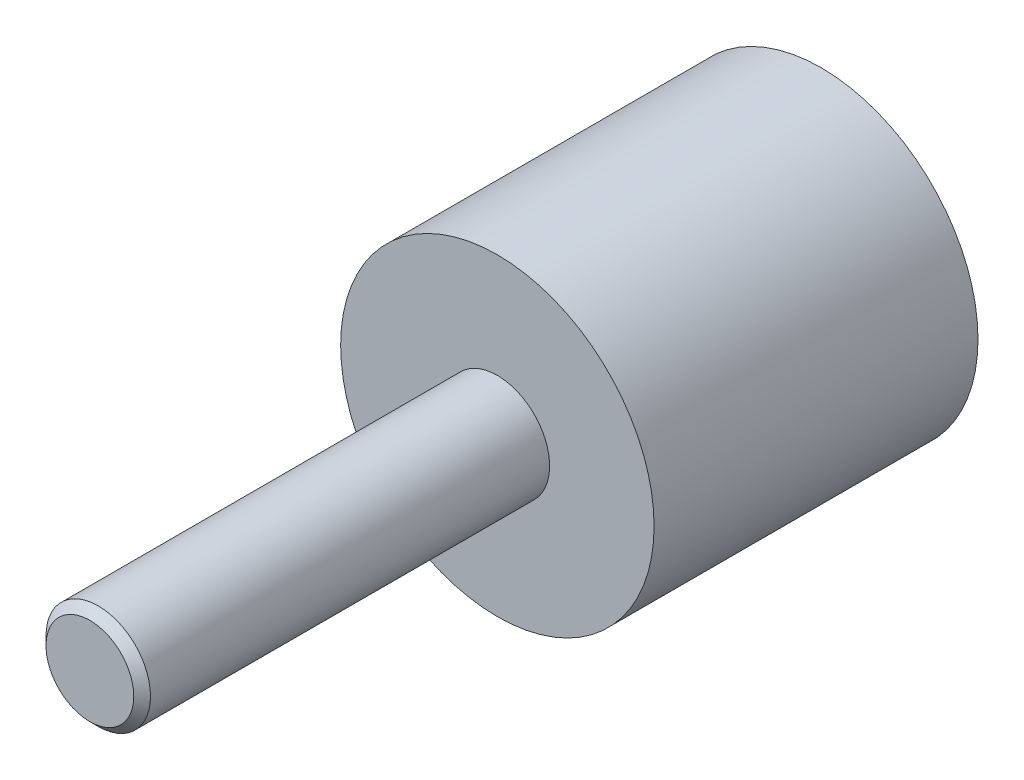
ISO-10303-21;
HEADER;
FILE_DESCRIPTION(('STEP AP214'),'2;1');
FILE_NAME('part.step','',(''),(''),'','','');
FILE_SCHEMA(('AUTOMOTIVE_DESIGN { 1 0 10303 214 1 1 1 1 }'));
ENDSEC;
DATA;
#1=APPLICATION_CONTEXT('core data for automotive mechanical design processes');
#2=APPLICATION_PROTOCOL_DEFINITION('international standard','automotive_design',2000,#1);
#3=PRODUCT_CONTEXT('',#1,'mechanical');
#4=PRODUCT('Part','Part','',(#3));
#5=PRODUCT_RELATED_PRODUCT_CATEGORY('part','',(#4));
#6=PRODUCT_DEFINITION_FORMATION('','',#4);
#7=PRODUCT_DEFINITION_CONTEXT('part definition',#1,'design');
#8=PRODUCT_DEFINITION('design','',#6,#7);
#9=PRODUCT_DEFINITION_SHAPE('','',#8);
#10=(LENGTH_UNIT() NAMED_UNIT(*) SI_UNIT(.MILLI.,.METRE.));
#11=(NAMED_UNIT(*) PLANE_ANGLE_UNIT() SI_UNIT($,.RADIAN.));
#12=(NAMED_UNIT(*) SI_UNIT($,.STERADIAN.) SOLID_ANGLE_UNIT());
#13=UNCERTAINTY_MEASURE_WITH_UNIT(LENGTH_MEASURE(1.E-05),#10,'distance_accuracy_value','');
#14=(GEOMETRIC_REPRESENTATION_CONTEXT(3) GLOBAL_UNCERTAINTY_ASSIGNED_CONTEXT((#13)) GLOBAL_UNIT_ASSIGNED_CONTEXT((#10,
#11,#12)) REPRESENTATION_CONTEXT('',''));
#15=CARTESIAN_POINT('',(0.,0.,0.));
#16=DIRECTION('',(0.,0.,1.));
#17=DIRECTION('',(1.,0.,0.));
#18=AXIS2_PLACEMENT_3D('',#15,#16,#17);
#19=CARTESIAN_POINT('',(0.,0.,0.));
#20=DIRECTION('',(0.,0.,1.));
#21=DIRECTION('',(1.,0.,0.));
#22=AXIS2_PLACEMENT_3D('',#19,#20,#21);
#23=PLANE('',#22);
#24=CARTESIAN_POINT('',(0.,0.,0.));
#25=DIRECTION('',(0.,0.,1.));
#26=DIRECTION('',(1.,0.,0.));
#27=AXIS2_PLACEMENT_3D('',#24,#25,#26);
#28=CIRCLE('',#27,2.66700000000002);
#29=CARTESIAN_POINT('',(2.66700000000002,0.,0.));
#30=VERTEX_POINT('',#29);
#31=EDGE_CURVE('E11',#30,#30,#28,.T.);
#32=ORIENTED_EDGE('',*,*,#31,.T.);
#33=EDGE_LOOP('',(#32));
#34=FACE_BOUND('',#33,.T.);
#35=ADVANCED_FACE('F37',(#34),#23,.T.);
#36=CARTESIAN_POINT('',(0.,0.,-44.45));
#37=DIRECTION('',(0.,0.,-1.));
#38=DIRECTION('',(-1.,0.,0.));
#39=AXIS2_PLACEMENT_3D('',#36,#37,#38);
#40=CYLINDRICAL_SURFACE('',#39,3.175);
#41=CARTESIAN_POINT('',(0.,0.,-0.507999999999981));
#42=DIRECTION('',(0.,0.,1.));
#43=DIRECTION('',(1.,0.,0.));
#44=AXIS2_PLACEMENT_3D('',#41,#42,#43);
#45=CIRCLE('',#44,3.175);
#46=CARTESIAN_POINT('',(3.175,0.,-0.507999999999981));
#47=VERTEX_POINT('',#46);
#48=EDGE_CURVE('E44',#47,#47,#45,.F.);
#49=ORIENTED_EDGE('',*,*,#48,.T.);
#50=EDGE_LOOP('',(#49));
#51=FACE_BOUND('',#50,.T.);
#52=CARTESIAN_POINT('',(0.,0.,-24.765));
#53=DIRECTION('',(0.,0.,-1.));
#54=DIRECTION('',(-1.,0.,0.));
#55=AXIS2_PLACEMENT_3D('',#52,#53,#54);
#56=CIRCLE('',#55,3.175);
#57=CARTESIAN_POINT('',(-3.175,0.,-24.765));
#58=VERTEX_POINT('',#57);
#59=EDGE_CURVE('E74',#58,#58,#56,.T.);
#60=ORIENTED_EDGE('',*,*,#59,.F.);
#61=EDGE_LOOP('',(#60));
#62=FACE_BOUND('',#61,.T.);
#63=ADVANCED_FACE('F85',(#51,#62),#40,.T.);
#64=CARTESIAN_POINT('',(0.,3.175,-24.765));
#65=DIRECTION('',(0.,0.,1.));
#66=DIRECTION('',(1.,0.,0.));
#67=AXIS2_PLACEMENT_3D('',#64,#65,#66);
#68=PLANE('',#67);
#69=ORIENTED_EDGE('',*,*,#59,.T.);
#70=EDGE_LOOP('',(#69));
#71=FACE_BOUND('',#70,.T.);
#72=CARTESIAN_POINT('',(0.,0.,-24.765));
#73=DIRECTION('',(0.,0.,-1.));
#74=DIRECTION('',(-1.,0.,0.));
#75=AXIS2_PLACEMENT_3D('',#72,#73,#74);
#76=CIRCLE('',#75,9.525);
#77=CARTESIAN_POINT('',(-9.525,0.,-24.765));
#78=VERTEX_POINT('',#77);
#79=EDGE_CURVE('E61',#78,#78,#76,.T.);
#80=ORIENTED_EDGE('',*,*,#79,.F.);
#81=EDGE_LOOP('',(#80));
#82=FACE_BOUND('',#81,.T.);
#83=ADVANCED_FACE('F104',(#71,#82),#68,.T.);
#84=CARTESIAN_POINT('',(0.,0.,-44.45));
#85=DIRECTION('',(0.,0.,-1.));
#86=DIRECTION('',(-1.,0.,0.));
#87=AXIS2_PLACEMENT_3D('',#84,#85,#86);
#88=CYLINDRICAL_SURFACE('',#87,9.525);
#89=CARTESIAN_POINT('',(0.,-9.525,-36.0553));
#90=CARTESIAN_POINT('',(0.0632509375219132,-9.52499915479188,-36.055297297543));
#91=CARTESIAN_POINT('',(0.126542029749758,-9.5243633064193,-36.0499728767562));
#92=CARTESIAN_POINT('',(0.251364820472078,-9.52188793721448,-36.0288157596332));
#93=CARTESIAN_POINT('',(0.312894581904218,-9.52004714057458,-36.0129719250133));
#94=CARTESIAN_POINT('',(0.432369436874991,-9.51536936505536,-35.9712478166958));
#95=CARTESIAN_POINT('',(0.490316847005159,-9.51253303804938,-35.9453741094042));
#96=CARTESIAN_POINT('',(0.601035404846345,-9.506180121912,-35.8843386531454));
#97=CARTESIAN_POINT('',(0.653807476710619,-9.5026636545669,-35.849178566591));
#98=CARTESIAN_POINT('',(0.75295182295395,-9.49532382723017,-35.7703809010455));
#99=CARTESIAN_POINT('',(0.799294604149035,-9.49149917244225,-35.7267063302383));
#100=CARTESIAN_POINT('',(0.884010990406445,-9.48398454417843,-35.6321987812117));
#101=CARTESIAN_POINT('',(0.9223842000221,-9.48029457739317,-35.5813654479875));
#102=CARTESIAN_POINT('',(0.990180703567409,-9.47345427413314,-35.4737934148364));
#103=CARTESIAN_POINT('',(1.01957659957805,-9.47030560217059,-35.4170373326192));
#104=CARTESIAN_POINT('',(1.06840907808638,-9.46492124661159,-35.299350669313));
#105=CARTESIAN_POINT('',(1.08784600183097,-9.46268553173296,-35.2384202313406));
#106=CARTESIAN_POINT('',(1.11611970355341,-9.45939245018979,-35.1144193257095));
#107=CARTESIAN_POINT('',(1.12500607633105,-9.45832957207026,-35.0513603151556));
#108=CARTESIAN_POINT('',(1.13207984575786,-9.45748558744171,-34.9246377020031));
#109=CARTESIAN_POINT('',(1.13026763163491,-9.45770443430195,-34.8609741214835));
#110=CARTESIAN_POINT('',(1.11603642445577,-9.45939413033264,-34.7351941413619));
#111=CARTESIAN_POINT('',(1.10367192939602,-9.4608585465419,-34.673071476993));
#112=CARTESIAN_POINT('',(1.06877210956582,-9.46486434331535,-34.5517891324808));
#113=CARTESIAN_POINT('',(1.04623659739191,-9.4674057437232,-34.4926295069546));
#114=CARTESIAN_POINT('',(0.991575435750871,-9.47328648500057,-34.3787824780618));
#115=CARTESIAN_POINT('',(0.959425968133552,-9.47662780348318,-34.3241066167749));
#116=CARTESIAN_POINT('',(0.886466559501058,-9.48373033604865,-34.2209055915384));
#117=CARTESIAN_POINT('',(0.845656261347887,-9.48749156744401,-34.1723806813613));
#118=CARTESIAN_POINT('',(0.756230970668205,-9.49503875161689,-34.0825425781642));
#119=CARTESIAN_POINT('',(0.707568978368591,-9.49882471254411,-34.041276155214));
#120=CARTESIAN_POINT('',(0.603983835638155,-9.5059728190733,-33.9674901344518));
#121=CARTESIAN_POINT('',(0.54906067309011,-9.50933496385503,-33.934970553568));
#122=CARTESIAN_POINT('',(0.434477192227891,-9.51525841591306,-33.8796018187119));
#123=CARTESIAN_POINT('',(0.374815519825478,-9.51781949323438,-33.8567554408717));
#124=CARTESIAN_POINT('',(0.252465658532564,-9.52185010274536,-33.8214179814958));
#125=CARTESIAN_POINT('',(0.189777597381649,-9.52331968096283,-33.8089264632998));
#126=CARTESIAN_POINT('',(0.0635590107666494,-9.52499574893122,-33.7947135769098));
#127=CARTESIAN_POINT('',(3.58400083115345E-05,-9.52520979797053,-33.7929277504638));
#128=CARTESIAN_POINT('',(-0.126404631849715,-9.5243710616825,-33.8000070558713));
#129=CARTESIAN_POINT('',(-0.189321944527946,-9.52331830061377,-33.8088719837697));
#130=CARTESIAN_POINT('',(-0.31257565042343,-9.52006897220776,-33.8369476249329));
#131=CARTESIAN_POINT('',(-0.372919106821374,-9.51787578670261,-33.8561277550712));
#132=CARTESIAN_POINT('',(-0.489532754276605,-9.51259128030109,-33.9042576519216));
#133=CARTESIAN_POINT('',(-0.545802819522162,-9.50949993167863,-33.9332077202341));
#134=CARTESIAN_POINT('',(-0.652961239170925,-9.50274519697551,-34.0002127279642));
#135=CARTESIAN_POINT('',(-0.703823242482479,-9.49907920769755,-34.0383095427701));
#136=CARTESIAN_POINT('',(-0.798454027403535,-9.49159384532421,-34.1224671551165));
#137=CARTESIAN_POINT('',(-0.84222255607325,-9.48777446676533,-34.1685282365267));
#138=CARTESIAN_POINT('',(-0.921651327981496,-9.48038962493188,-34.2675900911426));
#139=CARTESIAN_POINT('',(-0.957268957312505,-9.47682556018667,-34.3206251519108));
#140=CARTESIAN_POINT('',(-1.01909088187736,-9.47037744686408,-34.4319623704647));
#141=CARTESIAN_POINT('',(-1.04529534989561,-9.46749338580514,-34.4902644315466));
#142=CARTESIAN_POINT('',(-1.08747746493127,-9.46274116392142,-34.6103408097394));
#143=CARTESIAN_POINT('',(-1.10347950086257,-9.46087058199655,-34.6721064592944));
#144=CARTESIAN_POINT('',(-1.12488122562179,-9.45835002776142,-34.7974716266512));
#145=CARTESIAN_POINT('',(-1.13028135522926,-9.45770000470587,-34.8610710681007));
#146=CARTESIAN_POINT('',(-1.1303184331302,-9.45769553968786,-34.9878746425039));
#147=CARTESIAN_POINT('',(-1.12502232452988,-9.45833303967828,-35.0510787661036));
#148=CARTESIAN_POINT('',(-1.10395863981905,-9.46081450631757,-35.1756920137754));
#149=CARTESIAN_POINT('',(-1.08819105929352,-9.46265847347512,-35.2371011370908));
#150=CARTESIAN_POINT('',(-1.04665229311139,-9.4673426850713,-35.3563746331136));
#151=CARTESIAN_POINT('',(-1.02088399489125,-9.47018264192209,-35.4142400233998));
#152=CARTESIAN_POINT('',(-0.960081888687954,-9.47653934827966,-35.5248359739942));
#153=CARTESIAN_POINT('',(-0.925048010140118,-9.48005610294073,-35.5775664951921));
#154=CARTESIAN_POINT('',(-0.846459876445609,-9.4873965412942,-35.6767384262747));
#155=CARTESIAN_POINT('',(-0.802855698093828,-9.4912219419892,-35.7231401500643));
#156=CARTESIAN_POINT('',(-0.708467950989531,-9.49873331929353,-35.8079943441698));
#157=CARTESIAN_POINT('',(-0.657682685184871,-9.50241926268421,-35.8464449301491));
#158=CARTESIAN_POINT('',(-0.55017587524167,-9.50925025151029,-35.9144161624646));
#159=CARTESIAN_POINT('',(-0.493434507280825,-9.51239339223359,-35.9439056282208));
#160=CARTESIAN_POINT('',(-0.375800731512537,-9.51776504462355,-35.9928963446553));
#161=CARTESIAN_POINT('',(-0.314912964671017,-9.51999455988771,-36.0124085609953));
#162=CARTESIAN_POINT('',(-0.211418114793812,-9.5227440281588,-36.0361665421134));
#163=CARTESIAN_POINT('',(-0.169466299617016,-9.52358594491639,-36.0433314180665));
#164=CARTESIAN_POINT('',(-0.0850157018599239,-9.52471421312899,-36.0528990400399));
#165=CARTESIAN_POINT('',(-0.0425169227863945,-9.52500056814412,-36.0553018165763));
#166=CARTESIAN_POINT('',(0.,-9.525,-36.0553));
#167=B_SPLINE_CURVE_WITH_KNOTS('',3,(#89,#90,#91,#92,#93,#94,#95,#96,#97,#98,#99,#100,#101,#102,
#103,#104,#105,#106,#107,#108,#109,#110,#111,#112,#113,#114,#115,#116,#117,#118,#119,#120,#121,
#122,#123,#124,#125,#126,#127,#128,#129,#130,#131,#132,#133,#134,#135,#136,#137,#138,#139,#140,
#141,#142,#143,#144,#145,#146,#147,#148,#149,#150,#151,#152,#153,#154,#155,#156,#157,#158,#159,
#160,#161,#162,#163,#164,#165,#166),.UNSPECIFIED.,.T.,.F.,(4,2,2,2,2,2,2,2,2,2,2,2,2,2,2,2,2,2,
2,2,2,2,2,2,2,2,2,2,2,2,2,2,2,2,2,2,2,2,4),(0.,0.189597524312163,0.379396121234884,
0.569070669169936,0.758711285265451,0.949194948105546,1.13968806040505,1.33075686013229,
1.52181911239724,1.71197964005891,1.90213324948718,2.09131069927981,2.28049163485502,
2.47014519648381,2.65980658018673,2.8506485273792,3.04149084391374,3.232387893604,
3.4232768928326,3.61301539850876,3.80275027087081,3.99192568241037,4.18110693437604,
4.37117138460746,4.56124261068453,4.75228593782412,4.94332575806604,5.13390716820241,
5.32448065465381,5.51386512071869,5.70324966663246,5.89257957351562,6.08191092233626,
6.27237971236643,6.46289358990969,6.65406297150348,6.8450217911509,6.97246899232318,
7.09991537679581),.UNSPECIFIED.);
#168=CARTESIAN_POINT('',(0.,-9.525,-36.0553));
#169=VERTEX_POINT('',#168);
#170=EDGE_CURVE('E116',#169,#169,#167,.T.);
#171=ORIENTED_EDGE('',*,*,#170,.F.);
#172=EDGE_LOOP('',(#171));
#173=FACE_BOUND('',#172,.T.);
#174=CARTESIAN_POINT('',(0.,-9.525,-42.4053));
#175=CARTESIAN_POINT('',(0.0632509375219132,-9.52499915479188,-42.405297297543));
#176=CARTESIAN_POINT('',(0.126542029749758,-9.5243633064193,-42.3999728767562));
#177=CARTESIAN_POINT('',(0.251364820472078,-9.52188793721448,-42.3788157596331));
#178=CARTESIAN_POINT('',(0.312894581904218,-9.52004714057458,-42.3629719250133));
#179=CARTESIAN_POINT('',(0.432369436874991,-9.51536936505536,-42.3212478166958));
#180=CARTESIAN_POINT('',(0.490316847005159,-9.51253303804938,-42.2953741094042));
#181=CARTESIAN_POINT('',(0.601035404846345,-9.506180121912,-42.2343386531454));
#182=CARTESIAN_POINT('',(0.65380747671062,-9.5026636545669,-42.199178566591));
#183=CARTESIAN_POINT('',(0.752951822953947,-9.49532382723017,-42.1203809010455));
#184=CARTESIAN_POINT('',(0.79929460414903,-9.49149917244225,-42.0767063302383));
#185=CARTESIAN_POINT('',(0.884010990406441,-9.48398454417843,-41.9821987812117));
#186=CARTESIAN_POINT('',(0.922384200022098,-9.48029457739317,-41.9313654479875));
#187=CARTESIAN_POINT('',(0.990180703567409,-9.47345427413314,-41.8237934148364));
#188=CARTESIAN_POINT('',(1.01957659957805,-9.47030560217059,-41.7670373326192));
#189=CARTESIAN_POINT('',(1.06840907808638,-9.46492124661159,-41.649350669313));
#190=CARTESIAN_POINT('',(1.08784600183097,-9.46268553173296,-41.5884202313406));
#191=CARTESIAN_POINT('',(1.11611970355341,-9.45939245018979,-41.4644193257095));
#192=CARTESIAN_POINT('',(1.12500607633105,-9.45832957207026,-41.4013603151556));
#193=CARTESIAN_POINT('',(1.13207984575786,-9.45748558744171,-41.2746377020031));
#194=CARTESIAN_POINT('',(1.13026763163491,-9.45770443430195,-41.2109741214835));
#195=CARTESIAN_POINT('',(1.11603642445577,-9.45939413033264,-41.0851941413619));
#196=CARTESIAN_POINT('',(1.10367192939602,-9.4608585465419,-41.023071476993));
#197=CARTESIAN_POINT('',(1.06877210956582,-9.46486434331535,-40.9017891324808));
#198=CARTESIAN_POINT('',(1.04623659739191,-9.4674057437232,-40.8426295069546));
#199=CARTESIAN_POINT('',(0.99157543575087,-9.47328648500057,-40.7287824780617));
#200=CARTESIAN_POINT('',(0.95942596813355,-9.47662780348318,-40.6741066167748));
#201=CARTESIAN_POINT('',(0.886466559501056,-9.48373033604865,-40.5709055915384));
#202=CARTESIAN_POINT('',(0.845656261347885,-9.48749156744401,-40.5223806813613));
#203=CARTESIAN_POINT('',(0.756230970668205,-9.49503875161689,-40.4325425781642));
#204=CARTESIAN_POINT('',(0.707568978368591,-9.49882471254411,-40.391276155214));
#205=CARTESIAN_POINT('',(0.603983835638155,-9.5059728190733,-40.3174901344518));
#206=CARTESIAN_POINT('',(0.54906067309011,-9.50933496385503,-40.284970553568));
#207=CARTESIAN_POINT('',(0.434477192227891,-9.51525841591306,-40.2296018187119));
#208=CARTESIAN_POINT('',(0.374815519825478,-9.51781949323438,-40.2067554408717));
#209=CARTESIAN_POINT('',(0.252465658532564,-9.52185010274536,-40.1714179814958));
#210=CARTESIAN_POINT('',(0.189777597381649,-9.52331968096283,-40.1589264632998));
#211=CARTESIAN_POINT('',(0.0635590107666494,-9.52499574893122,-40.1447135769098));
#212=CARTESIAN_POINT('',(3.58400083115345E-05,-9.52520979797053,-40.1429277504638));
#213=CARTESIAN_POINT('',(-0.126404631849715,-9.5243710616825,-40.1500070558713));
#214=CARTESIAN_POINT('',(-0.189321944527946,-9.52331830061377,-40.1588719837697));
#215=CARTESIAN_POINT('',(-0.31257565042343,-9.52006897220776,-40.1869476249329));
#216=CARTESIAN_POINT('',(-0.372919106821374,-9.51787578670261,-40.2061277550712));
#217=CARTESIAN_POINT('',(-0.489532754276605,-9.51259128030109,-40.2542576519216));
#218=CARTESIAN_POINT('',(-0.545802819522162,-9.50949993167863,-40.2832077202341));
#219=CARTESIAN_POINT('',(-0.652961239170925,-9.50274519697551,-40.3502127279642));
#220=CARTESIAN_POINT('',(-0.703823242482479,-9.49907920769755,-40.3883095427701));
#221=CARTESIAN_POINT('',(-0.798454027403535,-9.49159384532421,-40.4724671551165));
#222=CARTESIAN_POINT('',(-0.84222255607325,-9.48777446676533,-40.5185282365267));
#223=CARTESIAN_POINT('',(-0.921651327981496,-9.48038962493188,-40.6175900911426));
#224=CARTESIAN_POINT('',(-0.957268957312505,-9.47682556018667,-40.6706251519108));
#225=CARTESIAN_POINT('',(-1.01909088187736,-9.47037744686408,-40.7819623704647));
#226=CARTESIAN_POINT('',(-1.04529534989561,-9.46749338580514,-40.8402644315466));
#227=CARTESIAN_POINT('',(-1.08747746493127,-9.46274116392142,-40.9603408097394));
#228=CARTESIAN_POINT('',(-1.10347950086257,-9.46087058199655,-41.0221064592943));
#229=CARTESIAN_POINT('',(-1.12488122562179,-9.45835002776142,-41.1474716266512));
#230=CARTESIAN_POINT('',(-1.13028135522926,-9.45770000470587,-41.2110710681007));
#231=CARTESIAN_POINT('',(-1.1303184331302,-9.45769553968786,-41.3378746425039));
#232=CARTESIAN_POINT('',(-1.12502232452988,-9.45833303967828,-41.4010787661036));
#233=CARTESIAN_POINT('',(-1.10395863981905,-9.46081450631757,-41.5256920137754));
#234=CARTESIAN_POINT('',(-1.08819105929352,-9.46265847347512,-41.5871011370908));
#235=CARTESIAN_POINT('',(-1.04665229311139,-9.4673426850713,-41.7063746331136));
#236=CARTESIAN_POINT('',(-1.02088399489125,-9.47018264192209,-41.7642400233998));
#237=CARTESIAN_POINT('',(-0.960081888687954,-9.47653934827966,-41.8748359739941));
#238=CARTESIAN_POINT('',(-0.925048010140118,-9.48005610294073,-41.9275664951921));
#239=CARTESIAN_POINT('',(-0.846459876445609,-9.4873965412942,-42.0267384262747));
#240=CARTESIAN_POINT('',(-0.802855698093828,-9.4912219419892,-42.0731401500643));
#241=CARTESIAN_POINT('',(-0.708467950989531,-9.49873331929353,-42.1579943441698));
#242=CARTESIAN_POINT('',(-0.657682685184871,-9.50241926268421,-42.1964449301491));
#243=CARTESIAN_POINT('',(-0.55017587524167,-9.50925025151029,-42.2644161624645));
#244=CARTESIAN_POINT('',(-0.493434507280825,-9.51239339223359,-42.2939056282208));
#245=CARTESIAN_POINT('',(-0.375800731512537,-9.51776504462355,-42.3428963446553));
#246=CARTESIAN_POINT('',(-0.314912964671017,-9.51999455988771,-42.3624085609953));
#247=CARTESIAN_POINT('',(-0.211418114793812,-9.5227440281588,-42.3861665421134));
#248=CARTESIAN_POINT('',(-0.169466299617016,-9.52358594491639,-42.3933314180665));
#249=CARTESIAN_POINT('',(-0.0850157018599239,-9.52471421312899,-42.4028990400399));
#250=CARTESIAN_POINT('',(-0.0425169227863945,-9.52500056814412,-42.4053018165763));
#251=CARTESIAN_POINT('',(0.,-9.525,-42.4053));
#252=B_SPLINE_CURVE_WITH_KNOTS('',3,(#174,#175,#176,#177,#178,#179,#180,#181,#182,#183,#184,
#185,#186,#187,#188,#189,#190,#191,#192,#193,#194,#195,#196,#197,#198,#199,#200,#201,#202,#203,
#204,#205,#206,#207,#208,#209,#210,#211,#212,#213,#214,#215,#216,#217,#218,#219,#220,#221,#222,
#223,#224,#225,#226,#227,#228,#229,#230,#231,#232,#233,#234,#235,#236,#237,#238,#239,#240,#241,
#242,#243,#244,#245,#246,#247,#248,#249,#250,#251),.UNSPECIFIED.,.T.,.F.,(4,2,2,2,2,2,2,2,2,2,2,
2,2,2,2,2,2,2,2,2,2,2,2,2,2,2,2,2,2,2,2,2,2,2,2,2,2,2,4),(0.,0.189597524312163,
0.379396121234884,0.569070669169936,0.758711285265451,0.949194948105536,1.13968806040505,
1.33075686013229,1.52181911239724,1.71197964005891,1.90213324948718,2.09131069927981,
2.28049163485502,2.47014519648381,2.65980658018673,2.8506485273792,3.04149084391374,
3.232387893604,3.4232768928326,3.61301539850876,3.80275027087081,3.99192568241037,
4.18110693437604,4.37117138460746,4.56124261068453,4.75228593782412,4.94332575806604,
5.13390716820241,5.32448065465381,5.51386512071869,5.70324966663246,5.89257957351562,
6.08191092233626,6.27237971236643,6.46289358990969,6.65406297150348,6.8450217911509,
6.97246899232318,7.09991537679581),.UNSPECIFIED.);
#253=CARTESIAN_POINT('',(0.,-9.525,-42.4053));
#254=VERTEX_POINT('',#253);
#255=EDGE_CURVE('E58',#254,#254,#252,.T.);
#256=ORIENTED_EDGE('',*,*,#255,.F.);
#257=EDGE_LOOP('',(#256));
#258=FACE_BOUND('',#257,.T.);
#259=ORIENTED_EDGE('',*,*,#79,.T.);
#260=EDGE_LOOP('',(#259));
#261=FACE_BOUND('',#260,.T.);
#262=CARTESIAN_POINT('',(0.,0.,-44.45));
#263=DIRECTION('',(0.,0.,-1.));
#264=DIRECTION('',(-1.,0.,0.));
#265=AXIS2_PLACEMENT_3D('',#262,#263,#264);
#266=CIRCLE('',#265,9.525);
#267=CARTESIAN_POINT('',(-9.525,0.,-44.45));
#268=VERTEX_POINT('',#267);
#269=EDGE_CURVE('E57',#268,#268,#266,.T.);
#270=ORIENTED_EDGE('',*,*,#269,.F.);
#271=EDGE_LOOP('',(#270));
#272=FACE_BOUND('',#271,.T.);
#273=ADVANCED_FACE('F108',(#173,#258,#261,#272),#88,.T.);
#274=CARTESIAN_POINT('',(0.,9.525,-44.45));
#275=DIRECTION('',(0.,0.,-1.));
#276=DIRECTION('',(-1.,0.,0.));
#277=AXIS2_PLACEMENT_3D('',#274,#275,#276);
#278=PLANE('',#277);
#279=CARTESIAN_POINT('',(0.,0.,-44.45));
#280=DIRECTION('',(0.,0.,-1.));
#281=DIRECTION('',(-1.,0.,0.));
#282=AXIS2_PLACEMENT_3D('',#279,#280,#281);
#283=CIRCLE('',#282,6.858);
#284=CARTESIAN_POINT('',(-6.858,0.,-44.45));
#285=VERTEX_POINT('',#284);
#286=EDGE_CURVE('E80',#285,#285,#283,.F.);
#287=ORIENTED_EDGE('',*,*,#286,.T.);
#288=EDGE_LOOP('',(#287));
#289=FACE_BOUND('',#288,.T.);
#290=ORIENTED_EDGE('',*,*,#269,.T.);
#291=EDGE_LOOP('',(#290));
#292=FACE_BOUND('',#291,.T.);
#293=ADVANCED_FACE('F51',(#289,#292),#278,.T.);
#294=CARTESIAN_POINT('',(0.,0.,-31.75));
#295=DIRECTION('',(0.,0.,-1.));
#296=DIRECTION('',(-1.,0.,0.));
#297=AXIS2_PLACEMENT_3D('',#294,#295,#296);
#298=CONICAL_SURFACE('',#297,6.35,1.02974425867665);
#299=CARTESIAN_POINT('',(0.,0.,-27.934535069175));
#300=VERTEX_POINT('',#299);
#301=VERTEX_LOOP('',#300);
#302=FACE_BOUND('',#301,.T.);
#303=CARTESIAN_POINT('',(0.,0.,-31.75));
#304=DIRECTION('',(0.,0.,-1.));
#305=DIRECTION('',(-1.,0.,0.));
#306=AXIS2_PLACEMENT_3D('',#303,#304,#305);
#307=CIRCLE('',#306,6.35);
#308=CARTESIAN_POINT('',(-6.35,0.,-31.75));
#309=VERTEX_POINT('',#308);
#310=EDGE_CURVE('E55',#309,#309,#307,.T.);
#311=ORIENTED_EDGE('',*,*,#310,.T.);
#312=EDGE_LOOP('',(#311));
#313=FACE_BOUND('',#312,.T.);
#314=ADVANCED_FACE('F47',(#302,#313),#298,.F.);
#315=CARTESIAN_POINT('',(0.,0.,-44.45));
#316=DIRECTION('',(0.,0.,-1.));
#317=DIRECTION('',(-1.,0.,0.));
#318=AXIS2_PLACEMENT_3D('',#315,#316,#317);
#319=CYLINDRICAL_SURFACE('',#318,6.34999999999999);
#320=CARTESIAN_POINT('',(0.,0.,-43.942));
#321=DIRECTION('',(0.,0.,-1.));
#322=DIRECTION('',(-1.,0.,0.));
#323=AXIS2_PLACEMENT_3D('',#320,#321,#322);
#324=CIRCLE('',#323,6.34999999999999);
#325=CARTESIAN_POINT('',(-6.34999999999999,0.,-43.942));
#326=VERTEX_POINT('',#325);
#327=EDGE_CURVE('E77',#326,#326,#324,.T.);
#328=ORIENTED_EDGE('',*,*,#327,.T.);
#329=EDGE_LOOP('',(#328));
#330=FACE_BOUND('',#329,.T.);
#331=CARTESIAN_POINT('',(0.,-6.34999999999999,-36.0553));
#332=CARTESIAN_POINT('',(0.0629563878791093,-6.34999888392139,-36.0552975358588));
#333=CARTESIAN_POINT('',(0.125945518180088,-6.34905403128447,-36.0500223318021));
#334=CARTESIAN_POINT('',(0.250152702081869,-6.34537585531729,-36.029072214923));
#335=CARTESIAN_POINT('',(0.31136914852081,-6.34264095902062,-36.0133881553497));
#336=CARTESIAN_POINT('',(0.430216353374726,-6.33568901554255,-35.972112560627));
#337=CARTESIAN_POINT('',(0.487850157656381,-6.33147324821674,-35.9465295787746));
#338=CARTESIAN_POINT('',(0.598001091171563,-6.32202140996736,-35.8862057604103));
#339=CARTESIAN_POINT('',(0.650518713767407,-6.3167854375703,-35.8514658081206));
#340=CARTESIAN_POINT('',(0.74952221648712,-6.30580881632519,-35.77341393982));
#341=CARTESIAN_POINT('',(0.795944583557263,-6.30006376112308,-35.7300220730176));
#342=CARTESIAN_POINT('',(0.880890742796278,-6.28874965760556,-35.6360701564786));
#343=CARTESIAN_POINT('',(0.919414000884791,-6.28318062121278,-35.5855096224394));
#344=CARTESIAN_POINT('',(0.987728082473346,-6.27280636489556,-35.4782125973316));
#345=CARTESIAN_POINT('',(1.01745513923004,-6.26800683286246,-35.4214349089762));
#346=CARTESIAN_POINT('',(1.0669249737415,-6.25977667220809,-35.3035918933421));
#347=CARTESIAN_POINT('',(1.08666852406105,-6.25634593766797,-35.2425268982494));
#348=CARTESIAN_POINT('',(1.11540879351234,-6.25128595112309,-35.1185193778503));
#349=CARTESIAN_POINT('',(1.12451576700911,-6.24963823052387,-35.0556031735483));
#350=CARTESIAN_POINT('',(1.1320664164924,-6.24827506974413,-34.9291158273611));
#351=CARTESIAN_POINT('',(1.13051095346756,-6.24855947354512,-34.8655447387717));
#352=CARTESIAN_POINT('',(1.11687047479473,-6.25101158981712,-34.7403454074331));
#353=CARTESIAN_POINT('',(1.10491011333064,-6.25315700585984,-34.6787030828505));
#354=CARTESIAN_POINT('',(1.07099533738571,-6.25905444840307,-34.5583141852722));
#355=CARTESIAN_POINT('',(1.049040536489,-6.26280653702217,-34.4995677243369));
#356=CARTESIAN_POINT('',(0.995636097085759,-6.2715182331776,-34.3862694559734));
#357=CARTESIAN_POINT('',(0.964135455052854,-6.27648429874685,-34.3317422066748));
#358=CARTESIAN_POINT('',(0.892569656940643,-6.28706003112924,-34.2287003160346));
#359=CARTESIAN_POINT('',(0.852503715015034,-6.29266975697481,-34.1801862270321));
#360=CARTESIAN_POINT('',(0.764269222158467,-6.3039982759432,-34.0898269353825));
#361=CARTESIAN_POINT('',(0.715993892439709,-6.30971748810976,-34.0480859830462));
#362=CARTESIAN_POINT('',(0.613070078093332,-6.32054731368641,-33.9732802859317));
#363=CARTESIAN_POINT('',(0.558421540967499,-6.32565792208253,-33.9402156126301));
#364=CARTESIAN_POINT('',(0.444198884642503,-6.33470353710573,-33.8836884751575));
#365=CARTESIAN_POINT('',(0.384619676136642,-6.33863730921633,-33.8602360849223));
#366=CARTESIAN_POINT('',(0.262282092255562,-6.34487632476616,-33.8237005590735));
#367=CARTESIAN_POINT('',(0.199524021375925,-6.34718172386837,-33.8106164322997));
#368=CARTESIAN_POINT('',(0.0735078508517701,-6.3498830677014,-33.7953321695874));
#369=CARTESIAN_POINT('',(0.0102676109126001,-6.35030409228236,-33.7929890670603));
#370=CARTESIAN_POINT('',(-0.115701348621398,-6.34925825163245,-33.7988709711615));
#371=CARTESIAN_POINT('',(-0.178430090650149,-6.34779146965247,-33.8070955117643));
#372=CARTESIAN_POINT('',(-0.301147522772468,-6.34315039678747,-33.8337603424249));
#373=CARTESIAN_POINT('',(-0.36115226452032,-6.33998807934094,-33.8521290241086));
#374=CARTESIAN_POINT('',(-0.477230535073565,-6.3323090400633,-33.8984837697222));
#375=CARTESIAN_POINT('',(-0.533303817796235,-6.32779223354355,-33.926470435027));
#376=CARTESIAN_POINT('',(-0.640542721018921,-6.31784277068134,-33.9915883000618));
#377=CARTESIAN_POINT('',(-0.69165391851603,-6.31240144327334,-34.0288077747074));
#378=CARTESIAN_POINT('',(-0.786956260083879,-6.30123054524762,-34.111214359984));
#379=CARTESIAN_POINT('',(-0.831146825340833,-6.29550095057328,-34.1564021363805));
#380=CARTESIAN_POINT('',(-0.911890524213836,-6.28431705815892,-34.2541070831868));
#381=CARTESIAN_POINT('',(-0.948346537135835,-6.27886684675114,-34.3067050581005));
#382=CARTESIAN_POINT('',(-1.01190558831821,-6.26893820466268,-34.4173624551639));
#383=CARTESIAN_POINT('',(-1.03900895164483,-6.26445974020939,-34.4754216874095));
#384=CARTESIAN_POINT('',(-1.08295206493416,-6.25701307344201,-34.5950952194019));
#385=CARTESIAN_POINT('',(-1.09983812432204,-6.25403806705126,-34.6566920718548));
#386=CARTESIAN_POINT('',(-1.12301156564012,-6.24991887731238,-34.7819059154928));
#387=CARTESIAN_POINT('',(-1.12930001283747,-6.24877450994984,-34.8455227029798));
#388=CARTESIAN_POINT('',(-1.13106684825176,-6.24845484979012,-34.9719992157033));
#389=CARTESIAN_POINT('',(-1.12669827021579,-6.24925168135854,-35.0348567842946));
#390=CARTESIAN_POINT('',(-1.10760816297116,-6.25266316282823,-35.1589267560641));
#391=CARTESIAN_POINT('',(-1.09288668165289,-6.25527780432067,-35.220139166851));
#392=CARTESIAN_POINT('',(-1.05357047523371,-6.26201909575183,-35.3391097605245));
#393=CARTESIAN_POINT('',(-1.02899073220675,-6.26614345047996,-35.3968730328797));
#394=CARTESIAN_POINT('',(-0.9706719556696,-6.27544134328701,-35.5074805580941));
#395=CARTESIAN_POINT('',(-0.93693236452578,-6.28061494523718,-35.5603245112116));
#396=CARTESIAN_POINT('',(-0.860712930365979,-6.29151580295165,-35.660363077428));
#397=CARTESIAN_POINT('',(-0.818121129276669,-6.29724959616527,-35.707471690834));
#398=CARTESIAN_POINT('',(-0.725641135508032,-6.30857437800571,-35.7939248181567));
#399=CARTESIAN_POINT('',(-0.675751266606114,-6.31416533347806,-35.8332675435114));
#400=CARTESIAN_POINT('',(-0.569614887399338,-6.32462666894717,-35.9033632555986));
#401=CARTESIAN_POINT('',(-0.513320736215192,-6.32949092933148,-35.9340450384979));
#402=CARTESIAN_POINT('',(-0.396310768817331,-6.3378912214025,-35.985467681174));
#403=CARTESIAN_POINT('',(-0.335599289969208,-6.34142853555048,-36.0062181447091));
#404=CARTESIAN_POINT('',(-0.22890119283783,-6.34603119498659,-36.0328383967695));
#405=CARTESIAN_POINT('',(-0.183549007984971,-6.3475113052666,-36.0412475339284));
#406=CARTESIAN_POINT('',(-0.0921370516835586,-6.34949610579554,-36.0524791777076));
#407=CARTESIAN_POINT('',(-0.0460772953483354,-6.35000081684932,-36.055301803486));
#408=CARTESIAN_POINT('',(0.,-6.34999999999999,-36.0553));
#409=B_SPLINE_CURVE_WITH_KNOTS('',3,(#331,#332,#333,#334,#335,#336,#337,#338,#339,#340,#341,
#342,#343,#344,#345,#346,#347,#348,#349,#350,#351,#352,#353,#354,#355,#356,#357,#358,#359,#360,
#361,#362,#363,#364,#365,#366,#367,#368,#369,#370,#371,#372,#373,#374,#375,#376,#377,#378,#379,
#380,#381,#382,#383,#384,#385,#386,#387,#388,#389,#390,#391,#392,#393,#394,#395,#396,#397,#398,
#399,#400,#401,#402,#403,#404,#405,#406,#407,#408),.UNSPECIFIED.,.T.,.F.,(4,2,2,2,2,2,2,2,2,2,2,
2,2,2,2,2,2,2,2,2,2,2,2,2,2,2,2,2,2,2,2,2,2,2,2,2,2,2,4),(0.,0.188700695089458,
0.377567430304385,0.566271335794908,0.754957026188631,0.945474674221972,1.13600519943005,
1.32788488763882,1.51974972513487,1.70960760659306,1.89945015726347,2.08704917225957,
2.27465544102885,2.46328231488539,2.65192650225096,2.84324403808115,3.03456314996839,
3.22608225995457,3.41758305935036,3.6065273740334,3.79546335669533,3.98308236329304,
4.17071310310581,4.36021202617093,4.54972678970789,4.74149628669667,4.93325911775941,
5.12414615244469,5.31501399810742,5.50315717677203,5.69129948513105,5.87915694151399,
6.06702583685677,6.25743369109013,6.44788534712722,6.63985995513198,6.83164854337839,
6.96976007448539,7.10786865969789),.UNSPECIFIED.);
#410=CARTESIAN_POINT('',(0.,-6.34999999999999,-36.0553));
#411=VERTEX_POINT('',#410);
#412=EDGE_CURVE('E122',#411,#411,#409,.T.);
#413=ORIENTED_EDGE('',*,*,#412,.T.);
#414=EDGE_LOOP('',(#413));
#415=FACE_BOUND('',#414,.T.);
#416=CARTESIAN_POINT('',(0.,-6.34999999999999,-42.4053));
#417=CARTESIAN_POINT('',(0.0629563878791092,-6.34999888392139,-42.4052975358588));
#418=CARTESIAN_POINT('',(0.125945518180088,-6.34905403128447,-42.4000223318021));
#419=CARTESIAN_POINT('',(0.250152702081869,-6.34537585531729,-42.3790722149229));
#420=CARTESIAN_POINT('',(0.311369148520811,-6.34264095902062,-42.3633881553496));
#421=CARTESIAN_POINT('',(0.430216353374725,-6.33568901554255,-42.322112560627));
#422=CARTESIAN_POINT('',(0.487850157656379,-6.33147324821674,-42.2965295787746));
#423=CARTESIAN_POINT('',(0.598001091171561,-6.32202140996736,-42.2362057604103));
#424=CARTESIAN_POINT('',(0.650518713767406,-6.3167854375703,-42.2014658081206));
#425=CARTESIAN_POINT('',(0.74952221648712,-6.30580881632519,-42.12341393982));
#426=CARTESIAN_POINT('',(0.795944583557263,-6.30006376112308,-42.0800220730176));
#427=CARTESIAN_POINT('',(0.880890742796278,-6.28874965760556,-41.9860701564785));
#428=CARTESIAN_POINT('',(0.919414000884791,-6.28318062121278,-41.9355096224394));
#429=CARTESIAN_POINT('',(0.987728082473345,-6.27280636489556,-41.8282125973316));
#430=CARTESIAN_POINT('',(1.01745513923004,-6.26800683286246,-41.7714349089762));
#431=CARTESIAN_POINT('',(1.0669249737415,-6.25977667220809,-41.6535918933421));
#432=CARTESIAN_POINT('',(1.08666852406105,-6.25634593766797,-41.5925268982494));
#433=CARTESIAN_POINT('',(1.11540879351234,-6.25128595112309,-41.4685193778503));
#434=CARTESIAN_POINT('',(1.12451576700911,-6.24963823052387,-41.4056031735483));
#435=CARTESIAN_POINT('',(1.1320664164924,-6.24827506974413,-41.2791158273611));
#436=CARTESIAN_POINT('',(1.13051095346756,-6.24855947354512,-41.2155447387717));
#437=CARTESIAN_POINT('',(1.11687047479473,-6.25101158981712,-41.0903454074331));
#438=CARTESIAN_POINT('',(1.10491011333064,-6.25315700585984,-41.0287030828505));
#439=CARTESIAN_POINT('',(1.07099533738571,-6.25905444840307,-40.9083141852722));
#440=CARTESIAN_POINT('',(1.049040536489,-6.26280653702217,-40.8495677243369));
#441=CARTESIAN_POINT('',(0.995636097085759,-6.2715182331776,-40.7362694559734));
#442=CARTESIAN_POINT('',(0.964135455052854,-6.27648429874685,-40.6817422066748));
#443=CARTESIAN_POINT('',(0.892569656940643,-6.28706003112924,-40.5787003160346));
#444=CARTESIAN_POINT('',(0.852503715015034,-6.29266975697481,-40.5301862270321));
#445=CARTESIAN_POINT('',(0.764269222158467,-6.3039982759432,-40.4398269353825));
#446=CARTESIAN_POINT('',(0.715993892439709,-6.30971748810976,-40.3980859830462));
#447=CARTESIAN_POINT('',(0.613070078093332,-6.32054731368641,-40.3232802859317));
#448=CARTESIAN_POINT('',(0.558421540967499,-6.32565792208253,-40.29021561263));
#449=CARTESIAN_POINT('',(0.444198884642503,-6.33470353710573,-40.2336884751575));
#450=CARTESIAN_POINT('',(0.384619676136642,-6.33863730921633,-40.2102360849223));
#451=CARTESIAN_POINT('',(0.262282092255562,-6.34487632476616,-40.1737005590735));
#452=CARTESIAN_POINT('',(0.199524021375925,-6.34718172386837,-40.1606164322997));
#453=CARTESIAN_POINT('',(0.0735078508517701,-6.3498830677014,-40.1453321695874));
#454=CARTESIAN_POINT('',(0.0102676109126001,-6.35030409228236,-40.1429890670603));
#455=CARTESIAN_POINT('',(-0.115701348621398,-6.34925825163245,-40.1488709711615));
#456=CARTESIAN_POINT('',(-0.178430090650149,-6.34779146965247,-40.1570955117643));
#457=CARTESIAN_POINT('',(-0.301147522772468,-6.34315039678747,-40.1837603424249));
#458=CARTESIAN_POINT('',(-0.36115226452032,-6.33998807934094,-40.2021290241086));
#459=CARTESIAN_POINT('',(-0.477230535073565,-6.3323090400633,-40.2484837697222));
#460=CARTESIAN_POINT('',(-0.533303817796235,-6.32779223354355,-40.276470435027));
#461=CARTESIAN_POINT('',(-0.640542721018921,-6.31784277068134,-40.3415883000618));
#462=CARTESIAN_POINT('',(-0.69165391851603,-6.31240144327334,-40.3788077747074));
#463=CARTESIAN_POINT('',(-0.786956260083879,-6.30123054524762,-40.461214359984));
#464=CARTESIAN_POINT('',(-0.831146825340833,-6.29550095057328,-40.5064021363805));
#465=CARTESIAN_POINT('',(-0.911890524213836,-6.28431705815892,-40.6041070831868));
#466=CARTESIAN_POINT('',(-0.948346537135835,-6.27886684675114,-40.6567050581005));
#467=CARTESIAN_POINT('',(-1.01190558831821,-6.26893820466268,-40.7673624551639));
#468=CARTESIAN_POINT('',(-1.03900895164483,-6.26445974020939,-40.8254216874095));
#469=CARTESIAN_POINT('',(-1.08295206493416,-6.25701307344201,-40.9450952194019));
#470=CARTESIAN_POINT('',(-1.09983812432204,-6.25403806705126,-41.0066920718548));
#471=CARTESIAN_POINT('',(-1.12301156564012,-6.24991887731238,-41.1319059154927));
#472=CARTESIAN_POINT('',(-1.12930001283747,-6.24877450994984,-41.1955227029798));
#473=CARTESIAN_POINT('',(-1.13106684825176,-6.24845484979012,-41.3219992157033));
#474=CARTESIAN_POINT('',(-1.12669827021579,-6.24925168135854,-41.3848567842946));
#475=CARTESIAN_POINT('',(-1.10760816297116,-6.25266316282823,-41.5089267560641));
#476=CARTESIAN_POINT('',(-1.09288668165289,-6.25527780432067,-41.570139166851));
#477=CARTESIAN_POINT('',(-1.05357047523371,-6.26201909575183,-41.6891097605245));
#478=CARTESIAN_POINT('',(-1.02899073220675,-6.26614345047996,-41.7468730328797));
#479=CARTESIAN_POINT('',(-0.9706719556696,-6.27544134328701,-41.8574805580941));
#480=CARTESIAN_POINT('',(-0.93693236452578,-6.28061494523718,-41.9103245112115));
#481=CARTESIAN_POINT('',(-0.860712930365979,-6.29151580295165,-42.010363077428));
#482=CARTESIAN_POINT('',(-0.818121129276669,-6.29724959616527,-42.057471690834));
#483=CARTESIAN_POINT('',(-0.725641135508032,-6.30857437800571,-42.1439248181567));
#484=CARTESIAN_POINT('',(-0.675751266606114,-6.31416533347806,-42.1832675435114));
#485=CARTESIAN_POINT('',(-0.569614887399337,-6.32462666894717,-42.2533632555986));
#486=CARTESIAN_POINT('',(-0.513320736215191,-6.32949092933148,-42.2840450384979));
#487=CARTESIAN_POINT('',(-0.396310768817329,-6.3378912214025,-42.335467681174));
#488=CARTESIAN_POINT('',(-0.335599289969207,-6.34142853555048,-42.3562181447091));
#489=CARTESIAN_POINT('',(-0.22890119283783,-6.34603119498659,-42.3828383967695));
#490=CARTESIAN_POINT('',(-0.183549007984971,-6.3475113052666,-42.3912475339284));
#491=CARTESIAN_POINT('',(-0.0921370516835586,-6.34949610579554,-42.4024791777076));
#492=CARTESIAN_POINT('',(-0.0460772953483353,-6.35000081684932,-42.405301803486));
#493=CARTESIAN_POINT('',(0.,-6.34999999999999,-42.4053));
#494=B_SPLINE_CURVE_WITH_KNOTS('',3,(#416,#417,#418,#419,#420,#421,#422,#423,#424,#425,#426,
#427,#428,#429,#430,#431,#432,#433,#434,#435,#436,#437,#438,#439,#440,#441,#442,#443,#444,#445,
#446,#447,#448,#449,#450,#451,#452,#453,#454,#455,#456,#457,#458,#459,#460,#461,#462,#463,#464,
#465,#466,#467,#468,#469,#470,#471,#472,#473,#474,#475,#476,#477,#478,#479,#480,#481,#482,#483,
#484,#485,#486,#487,#488,#489,#490,#491,#492,#493),.UNSPECIFIED.,.T.,.F.,(4,2,2,2,2,2,2,2,2,2,2,
2,2,2,2,2,2,2,2,2,2,2,2,2,2,2,2,2,2,2,2,2,2,2,2,2,2,2,4),(0.,0.188700695089458,
0.377567430304385,0.566271335794906,0.754957026188631,0.945474674221972,1.13600519943005,
1.32788488763881,1.51974972513487,1.70960760659306,1.89945015726347,2.08704917225956,
2.27465544102885,2.46328231488539,2.65192650225096,2.84324403808115,3.03456314996839,
3.22608225995457,3.41758305935036,3.6065273740334,3.79546335669533,3.98308236329304,
4.17071310310581,4.36021202617093,4.54972678970789,4.74149628669667,4.93325911775941,
5.12414615244469,5.31501399810742,5.50315717677203,5.69129948513105,5.87915694151399,
6.06702583685677,6.25743369109013,6.44788534712722,6.63985995513198,6.83164854337839,
6.96976007448539,7.10786865969789),.UNSPECIFIED.);
#495=CARTESIAN_POINT('',(0.,-6.34999999999999,-42.4053));
#496=VERTEX_POINT('',#495);
#497=EDGE_CURVE('E64',#496,#496,#494,.T.);
#498=ORIENTED_EDGE('',*,*,#497,.T.);
#499=EDGE_LOOP('',(#498));
#500=FACE_BOUND('',#499,.T.);
#501=ORIENTED_EDGE('',*,*,#310,.F.);
#502=EDGE_LOOP('',(#501));
#503=FACE_BOUND('',#502,.T.);
#504=ADVANCED_FACE('F50',(#330,#415,#500,#503),#319,.F.);
#505=CARTESIAN_POINT('',(0.,-9.525,-41.275));
#506=DIRECTION('',(0.,-1.,0.));
#507=DIRECTION('',(0.,0.,-1.));
#508=AXIS2_PLACEMENT_3D('',#505,#506,#507);
#509=CYLINDRICAL_SURFACE('',#508,1.13029999999999);
#510=ORIENTED_EDGE('',*,*,#255,.T.);
#511=EDGE_LOOP('',(#510));
#512=FACE_BOUND('',#511,.T.);
#513=ORIENTED_EDGE('',*,*,#497,.F.);
#514=EDGE_LOOP('',(#513));
#515=FACE_BOUND('',#514,.T.);
#516=ADVANCED_FACE('F131',(#512,#515),#509,.F.);
#517=CARTESIAN_POINT('',(0.,-9.525,-34.925));
#518=DIRECTION('',(0.,-1.,0.));
#519=DIRECTION('',(0.,0.,-1.));
#520=AXIS2_PLACEMENT_3D('',#517,#518,#519);
#521=CYLINDRICAL_SURFACE('',#520,1.13029999999999);
#522=ORIENTED_EDGE('',*,*,#170,.T.);
#523=EDGE_LOOP('',(#522));
#524=FACE_BOUND('',#523,.T.);
#525=ORIENTED_EDGE('',*,*,#412,.F.);
#526=EDGE_LOOP('',(#525));
#527=FACE_BOUND('',#526,.T.);
#528=ADVANCED_FACE('F94',(#524,#527),#521,.F.);
#529=CARTESIAN_POINT('',(0.,0.,-43.942));
#530=DIRECTION('',(0.,0.,-1.));
#531=DIRECTION('',(-1.,0.,0.));
#532=AXIS2_PLACEMENT_3D('',#529,#530,#531);
#533=CONICAL_SURFACE('',#532,6.34999999999999,0.78539816339745);
#534=ORIENTED_EDGE('',*,*,#286,.F.);
#535=EDGE_LOOP('',(#534));
#536=FACE_BOUND('',#535,.T.);
#537=ORIENTED_EDGE('',*,*,#327,.F.);
#538=EDGE_LOOP('',(#537));
#539=FACE_BOUND('',#538,.T.);
#540=ADVANCED_FACE('F89',(#536,#539),#533,.F.);
#541=CARTESIAN_POINT('',(0.,0.,-0.507999999999981));
#542=DIRECTION('',(0.,0.,-1.));
#543=DIRECTION('',(-1.,0.,0.));
#544=AXIS2_PLACEMENT_3D('',#541,#542,#543);
#545=CONICAL_SURFACE('',#544,3.175,0.78539816339745);
#546=ORIENTED_EDGE('',*,*,#31,.F.);
#547=EDGE_LOOP('',(#546));
#548=FACE_BOUND('',#547,.T.);
#549=ORIENTED_EDGE('',*,*,#48,.F.);
#550=EDGE_LOOP('',(#549));
#551=FACE_BOUND('',#550,.T.);
#552=ADVANCED_FACE('F39',(#548,#551),#545,.T.);
#553=CLOSED_SHELL('',(#35,#63,#83,#273,#293,#314,#504,#516,#528,#540,#552));
#554=MANIFOLD_SOLID_BREP('B2',#553);
#555=ADVANCED_BREP_SHAPE_REPRESENTATION('',(#18,#554),#14);
#556=SHAPE_DEFINITION_REPRESENTATION(#9,#555);
ENDSEC;
END-ISO-10303-21;
